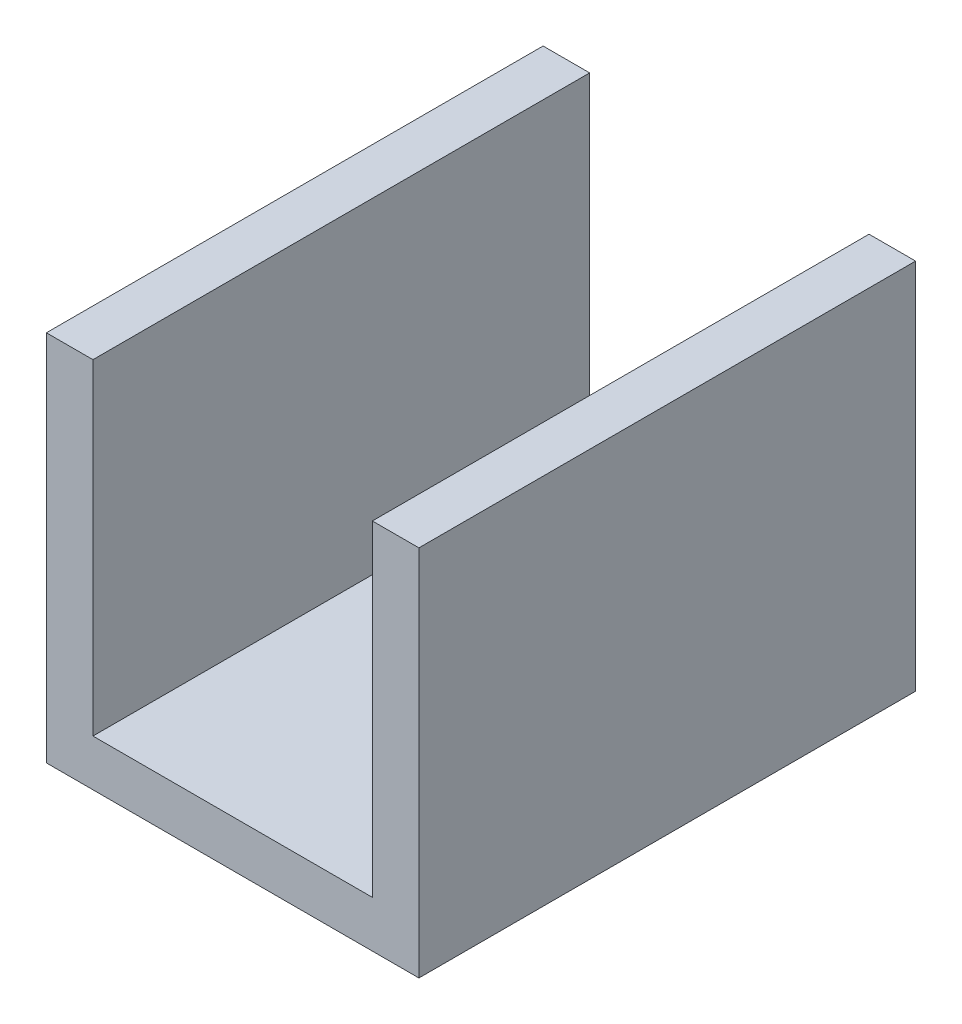
ISO-10303-21;
HEADER;
FILE_DESCRIPTION(('STEP AP214'),'2;1');
FILE_NAME('part.step','',(''),(''),'','','');
FILE_SCHEMA(('AUTOMOTIVE_DESIGN { 1 0 10303 214 1 1 1 1 }'));
ENDSEC;
DATA;
#1=APPLICATION_CONTEXT('core data for automotive mechanical design processes');
#2=APPLICATION_PROTOCOL_DEFINITION('international standard','automotive_design',2000,#1);
#3=PRODUCT_CONTEXT('',#1,'mechanical');
#4=PRODUCT('Part','Part','',(#3));
#5=PRODUCT_RELATED_PRODUCT_CATEGORY('part','',(#4));
#6=PRODUCT_DEFINITION_FORMATION('','',#4);
#7=PRODUCT_DEFINITION_CONTEXT('part definition',#1,'design');
#8=PRODUCT_DEFINITION('design','',#6,#7);
#9=PRODUCT_DEFINITION_SHAPE('','',#8);
#10=(LENGTH_UNIT() NAMED_UNIT(*) SI_UNIT(.MILLI.,.METRE.));
#11=(NAMED_UNIT(*) PLANE_ANGLE_UNIT() SI_UNIT($,.RADIAN.));
#12=(NAMED_UNIT(*) SI_UNIT($,.STERADIAN.) SOLID_ANGLE_UNIT());
#13=UNCERTAINTY_MEASURE_WITH_UNIT(LENGTH_MEASURE(1.E-05),#10,'distance_accuracy_value','');
#14=(GEOMETRIC_REPRESENTATION_CONTEXT(3) GLOBAL_UNCERTAINTY_ASSIGNED_CONTEXT((#13)) GLOBAL_UNIT_ASSIGNED_CONTEXT((#10,
#11,#12)) REPRESENTATION_CONTEXT('',''));
#15=CARTESIAN_POINT('',(0.,0.,0.));
#16=DIRECTION('',(0.,0.,1.));
#17=DIRECTION('',(1.,0.,0.));
#18=AXIS2_PLACEMENT_3D('',#15,#16,#17);
#19=CARTESIAN_POINT('',(-7.14375,2.38125,12.7));
#20=DIRECTION('',(-1.,0.,0.));
#21=DIRECTION('',(0.,-1.,0.));
#22=AXIS2_PLACEMENT_3D('',#19,#20,#21);
#23=PLANE('',#22);
#24=DIRECTION('',(0.,1.,0.));
#25=VECTOR('',#24,1.);
#26=CARTESIAN_POINT('',(-7.14375,2.38125,-12.7));
#27=LINE('',#26,#25);
#28=CARTESIAN_POINT('',(-7.14375,2.38125,-12.7));
#29=VERTEX_POINT('',#28);
#30=CARTESIAN_POINT('',(-7.14375,19.05,-12.7));
#31=VERTEX_POINT('',#30);
#32=EDGE_CURVE('E142',#29,#31,#27,.T.);
#33=ORIENTED_EDGE('',*,*,#32,.T.);
#34=DIRECTION('',(0.,0.,-1.));
#35=VECTOR('',#34,1.);
#36=CARTESIAN_POINT('',(-7.14375,19.05,12.7));
#37=LINE('',#36,#35);
#38=CARTESIAN_POINT('',(-7.14375,19.05,12.7));
#39=VERTEX_POINT('',#38);
#40=EDGE_CURVE('E11',#39,#31,#37,.T.);
#41=ORIENTED_EDGE('',*,*,#40,.F.);
#42=DIRECTION('',(0.,1.,0.));
#43=VECTOR('',#42,1.);
#44=CARTESIAN_POINT('',(-7.14375,2.38125,12.7));
#45=LINE('',#44,#43);
#46=CARTESIAN_POINT('',(-7.14375,2.38125,12.7));
#47=VERTEX_POINT('',#46);
#48=EDGE_CURVE('E164',#47,#39,#45,.T.);
#49=ORIENTED_EDGE('',*,*,#48,.F.);
#50=DIRECTION('',(0.,0.,-1.));
#51=VECTOR('',#50,1.);
#52=CARTESIAN_POINT('',(-7.14375,2.38125,12.7));
#53=LINE('',#52,#51);
#54=EDGE_CURVE('E138',#47,#29,#53,.T.);
#55=ORIENTED_EDGE('',*,*,#54,.T.);
#56=EDGE_LOOP('',(#33,#41,#49,#55));
#57=FACE_BOUND('',#56,.T.);
#58=ADVANCED_FACE('F41',(#57),#23,.F.);
#59=CARTESIAN_POINT('',(-7.14375,19.05,12.7));
#60=DIRECTION('',(0.,-1.,0.));
#61=DIRECTION('',(0.,0.,-1.));
#62=AXIS2_PLACEMENT_3D('',#59,#60,#61);
#63=PLANE('',#62);
#64=DIRECTION('',(-1.,0.,0.));
#65=VECTOR('',#64,1.);
#66=CARTESIAN_POINT('',(-7.14375,19.05,-12.7));
#67=LINE('',#66,#65);
#68=CARTESIAN_POINT('',(-9.525,19.05,-12.7));
#69=VERTEX_POINT('',#68);
#70=EDGE_CURVE('E146',#31,#69,#67,.T.);
#71=ORIENTED_EDGE('',*,*,#70,.T.);
#72=DIRECTION('',(0.,0.,-1.));
#73=VECTOR('',#72,1.);
#74=CARTESIAN_POINT('',(-9.525,19.05,12.7));
#75=LINE('',#74,#73);
#76=CARTESIAN_POINT('',(-9.525,19.05,12.7));
#77=VERTEX_POINT('',#76);
#78=EDGE_CURVE('E50',#77,#69,#75,.T.);
#79=ORIENTED_EDGE('',*,*,#78,.F.);
#80=DIRECTION('',(-1.,0.,0.));
#81=VECTOR('',#80,1.);
#82=CARTESIAN_POINT('',(-7.14375,19.05,12.7));
#83=LINE('',#82,#81);
#84=EDGE_CURVE('E101',#39,#77,#83,.T.);
#85=ORIENTED_EDGE('',*,*,#84,.F.);
#86=ORIENTED_EDGE('',*,*,#40,.T.);
#87=EDGE_LOOP('',(#71,#79,#85,#86));
#88=FACE_BOUND('',#87,.T.);
#89=ADVANCED_FACE('F210',(#88),#63,.F.);
#90=CARTESIAN_POINT('',(-9.525,19.05,12.7));
#91=DIRECTION('',(1.,0.,0.));
#92=DIRECTION('',(0.,1.,0.));
#93=AXIS2_PLACEMENT_3D('',#90,#91,#92);
#94=PLANE('',#93);
#95=DIRECTION('',(0.,-1.,0.));
#96=VECTOR('',#95,1.);
#97=CARTESIAN_POINT('',(-9.525,19.05,-12.7));
#98=LINE('',#97,#96);
#99=CARTESIAN_POINT('',(-9.525,0.,-12.7));
#100=VERTEX_POINT('',#99);
#101=EDGE_CURVE('E149',#69,#100,#98,.T.);
#102=ORIENTED_EDGE('',*,*,#101,.T.);
#103=DIRECTION('',(0.,0.,-1.));
#104=VECTOR('',#103,1.);
#105=CARTESIAN_POINT('',(-9.525,0.,12.7));
#106=LINE('',#105,#104);
#107=CARTESIAN_POINT('',(-9.525,0.,12.7));
#108=VERTEX_POINT('',#107);
#109=EDGE_CURVE('E175',#108,#100,#106,.T.);
#110=ORIENTED_EDGE('',*,*,#109,.F.);
#111=DIRECTION('',(0.,-1.,0.));
#112=VECTOR('',#111,1.);
#113=CARTESIAN_POINT('',(-9.525,19.05,12.7));
#114=LINE('',#113,#112);
#115=EDGE_CURVE('E185',#77,#108,#114,.T.);
#116=ORIENTED_EDGE('',*,*,#115,.F.);
#117=ORIENTED_EDGE('',*,*,#78,.T.);
#118=EDGE_LOOP('',(#102,#110,#116,#117));
#119=FACE_BOUND('',#118,.T.);
#120=ADVANCED_FACE('F183',(#119),#94,.F.);
#121=CARTESIAN_POINT('',(-9.525,0.,12.7));
#122=DIRECTION('',(0.,1.,0.));
#123=DIRECTION('',(0.,0.,1.));
#124=AXIS2_PLACEMENT_3D('',#121,#122,#123);
#125=PLANE('',#124);
#126=DIRECTION('',(1.,0.,0.));
#127=VECTOR('',#126,1.);
#128=CARTESIAN_POINT('',(-9.525,0.,-12.7));
#129=LINE('',#128,#127);
#130=CARTESIAN_POINT('',(9.525,0.,-12.7));
#131=VERTEX_POINT('',#130);
#132=EDGE_CURVE('E152',#100,#131,#129,.T.);
#133=ORIENTED_EDGE('',*,*,#132,.T.);
#134=DIRECTION('',(0.,0.,-1.));
#135=VECTOR('',#134,1.);
#136=CARTESIAN_POINT('',(9.525,0.,12.7));
#137=LINE('',#136,#135);
#138=CARTESIAN_POINT('',(9.525,0.,12.7));
#139=VERTEX_POINT('',#138);
#140=EDGE_CURVE('E171',#139,#131,#137,.T.);
#141=ORIENTED_EDGE('',*,*,#140,.F.);
#142=DIRECTION('',(1.,0.,0.));
#143=VECTOR('',#142,1.);
#144=CARTESIAN_POINT('',(-9.525,0.,12.7));
#145=LINE('',#144,#143);
#146=EDGE_CURVE('E198',#108,#139,#145,.T.);
#147=ORIENTED_EDGE('',*,*,#146,.F.);
#148=ORIENTED_EDGE('',*,*,#109,.T.);
#149=EDGE_LOOP('',(#133,#141,#147,#148));
#150=FACE_BOUND('',#149,.T.);
#151=ADVANCED_FACE('F193',(#150),#125,.F.);
#152=CARTESIAN_POINT('',(9.525,0.,12.7));
#153=DIRECTION('',(-1.,0.,0.));
#154=DIRECTION('',(0.,-1.,0.));
#155=AXIS2_PLACEMENT_3D('',#152,#153,#154);
#156=PLANE('',#155);
#157=DIRECTION('',(0.,1.,0.));
#158=VECTOR('',#157,1.);
#159=CARTESIAN_POINT('',(9.525,0.,-12.7));
#160=LINE('',#159,#158);
#161=CARTESIAN_POINT('',(9.525,19.05,-12.7));
#162=VERTEX_POINT('',#161);
#163=EDGE_CURVE('E155',#131,#162,#160,.T.);
#164=ORIENTED_EDGE('',*,*,#163,.T.);
#165=DIRECTION('',(0.,0.,-1.));
#166=VECTOR('',#165,1.);
#167=CARTESIAN_POINT('',(9.525,19.05,12.7));
#168=LINE('',#167,#166);
#169=CARTESIAN_POINT('',(9.525,19.05,12.7));
#170=VERTEX_POINT('',#169);
#171=EDGE_CURVE('E131',#170,#162,#168,.T.);
#172=ORIENTED_EDGE('',*,*,#171,.F.);
#173=DIRECTION('',(0.,1.,0.));
#174=VECTOR('',#173,1.);
#175=CARTESIAN_POINT('',(9.525,0.,12.7));
#176=LINE('',#175,#174);
#177=EDGE_CURVE('E120',#139,#170,#176,.T.);
#178=ORIENTED_EDGE('',*,*,#177,.F.);
#179=ORIENTED_EDGE('',*,*,#140,.T.);
#180=EDGE_LOOP('',(#164,#172,#178,#179));
#181=FACE_BOUND('',#180,.T.);
#182=ADVANCED_FACE('F196',(#181),#156,.F.);
#183=CARTESIAN_POINT('',(9.525,19.05,12.7));
#184=DIRECTION('',(0.,-1.,0.));
#185=DIRECTION('',(0.,0.,-1.));
#186=AXIS2_PLACEMENT_3D('',#183,#184,#185);
#187=PLANE('',#186);
#188=DIRECTION('',(-1.,0.,0.));
#189=VECTOR('',#188,1.);
#190=CARTESIAN_POINT('',(9.525,19.05,-12.7));
#191=LINE('',#190,#189);
#192=CARTESIAN_POINT('',(7.14375,19.05,-12.7));
#193=VERTEX_POINT('',#192);
#194=EDGE_CURVE('E129',#162,#193,#191,.T.);
#195=ORIENTED_EDGE('',*,*,#194,.T.);
#196=DIRECTION('',(0.,0.,-1.));
#197=VECTOR('',#196,1.);
#198=CARTESIAN_POINT('',(7.14375,19.05,12.7));
#199=LINE('',#198,#197);
#200=CARTESIAN_POINT('',(7.14375,19.05,12.7));
#201=VERTEX_POINT('',#200);
#202=EDGE_CURVE('E126',#201,#193,#199,.T.);
#203=ORIENTED_EDGE('',*,*,#202,.F.);
#204=DIRECTION('',(-1.,0.,0.));
#205=VECTOR('',#204,1.);
#206=CARTESIAN_POINT('',(9.525,19.05,12.7));
#207=LINE('',#206,#205);
#208=EDGE_CURVE('E114',#170,#201,#207,.T.);
#209=ORIENTED_EDGE('',*,*,#208,.F.);
#210=ORIENTED_EDGE('',*,*,#171,.T.);
#211=EDGE_LOOP('',(#195,#203,#209,#210));
#212=FACE_BOUND('',#211,.T.);
#213=ADVANCED_FACE('F127',(#212),#187,.F.);
#214=CARTESIAN_POINT('',(7.14375,19.05,12.7));
#215=DIRECTION('',(1.,0.,0.));
#216=DIRECTION('',(0.,1.,0.));
#217=AXIS2_PLACEMENT_3D('',#214,#215,#216);
#218=PLANE('',#217);
#219=DIRECTION('',(0.,-1.,0.));
#220=VECTOR('',#219,1.);
#221=CARTESIAN_POINT('',(7.14375,19.05,-12.7));
#222=LINE('',#221,#220);
#223=CARTESIAN_POINT('',(7.14375,2.38125,-12.7));
#224=VERTEX_POINT('',#223);
#225=EDGE_CURVE('E87',#193,#224,#222,.T.);
#226=ORIENTED_EDGE('',*,*,#225,.T.);
#227=DIRECTION('',(0.,0.,-1.));
#228=VECTOR('',#227,1.);
#229=CARTESIAN_POINT('',(7.14375,2.38125,12.7));
#230=LINE('',#229,#228);
#231=CARTESIAN_POINT('',(7.14375,2.38125,12.7));
#232=VERTEX_POINT('',#231);
#233=EDGE_CURVE('E132',#232,#224,#230,.T.);
#234=ORIENTED_EDGE('',*,*,#233,.F.);
#235=DIRECTION('',(0.,-1.,0.));
#236=VECTOR('',#235,1.);
#237=CARTESIAN_POINT('',(7.14375,19.05,12.7));
#238=LINE('',#237,#236);
#239=EDGE_CURVE('E118',#201,#232,#238,.T.);
#240=ORIENTED_EDGE('',*,*,#239,.F.);
#241=ORIENTED_EDGE('',*,*,#202,.T.);
#242=EDGE_LOOP('',(#226,#234,#240,#241));
#243=FACE_BOUND('',#242,.T.);
#244=ADVANCED_FACE('F134',(#243),#218,.F.);
#245=CARTESIAN_POINT('',(7.14375,2.38125,12.7));
#246=DIRECTION('',(0.,-1.,0.));
#247=DIRECTION('',(0.,0.,-1.));
#248=AXIS2_PLACEMENT_3D('',#245,#246,#247);
#249=PLANE('',#248);
#250=DIRECTION('',(-1.,0.,0.));
#251=VECTOR('',#250,1.);
#252=CARTESIAN_POINT('',(7.14375,2.38125,-12.7));
#253=LINE('',#252,#251);
#254=EDGE_CURVE('E93',#224,#29,#253,.T.);
#255=ORIENTED_EDGE('',*,*,#254,.T.);
#256=ORIENTED_EDGE('',*,*,#54,.F.);
#257=DIRECTION('',(-1.,0.,0.));
#258=VECTOR('',#257,1.);
#259=CARTESIAN_POINT('',(7.14375,2.38125,12.7));
#260=LINE('',#259,#258);
#261=EDGE_CURVE('E58',#232,#47,#260,.T.);
#262=ORIENTED_EDGE('',*,*,#261,.F.);
#263=ORIENTED_EDGE('',*,*,#233,.T.);
#264=EDGE_LOOP('',(#255,#256,#262,#263));
#265=FACE_BOUND('',#264,.T.);
#266=ADVANCED_FACE('F226',(#265),#249,.F.);
#267=CARTESIAN_POINT('',(-7.14375,19.05,12.7));
#268=DIRECTION('',(0.,0.,1.));
#269=DIRECTION('',(1.,0.,0.));
#270=AXIS2_PLACEMENT_3D('',#267,#268,#269);
#271=PLANE('',#270);
#272=ORIENTED_EDGE('',*,*,#48,.T.);
#273=ORIENTED_EDGE('',*,*,#84,.T.);
#274=ORIENTED_EDGE('',*,*,#115,.T.);
#275=ORIENTED_EDGE('',*,*,#146,.T.);
#276=ORIENTED_EDGE('',*,*,#177,.T.);
#277=ORIENTED_EDGE('',*,*,#208,.T.);
#278=ORIENTED_EDGE('',*,*,#239,.T.);
#279=ORIENTED_EDGE('',*,*,#261,.T.);
#280=EDGE_LOOP('',(#272,#273,#274,#275,#276,#277,#278,#279));
#281=FACE_BOUND('',#280,.T.);
#282=ADVANCED_FACE('F116',(#281),#271,.T.);
#283=CARTESIAN_POINT('',(-7.14375,19.05,-12.7));
#284=DIRECTION('',(0.,0.,1.));
#285=DIRECTION('',(1.,0.,0.));
#286=AXIS2_PLACEMENT_3D('',#283,#284,#285);
#287=PLANE('',#286);
#288=ORIENTED_EDGE('',*,*,#32,.F.);
#289=ORIENTED_EDGE('',*,*,#254,.F.);
#290=ORIENTED_EDGE('',*,*,#225,.F.);
#291=ORIENTED_EDGE('',*,*,#194,.F.);
#292=ORIENTED_EDGE('',*,*,#163,.F.);
#293=ORIENTED_EDGE('',*,*,#132,.F.);
#294=ORIENTED_EDGE('',*,*,#101,.F.);
#295=ORIENTED_EDGE('',*,*,#70,.F.);
#296=EDGE_LOOP('',(#288,#289,#290,#291,#292,#293,#294,#295));
#297=FACE_BOUND('',#296,.T.);
#298=ADVANCED_FACE('F189',(#297),#287,.F.);
#299=CLOSED_SHELL('',(#58,#89,#120,#151,#182,#213,#244,#266,#282,#298));
#300=MANIFOLD_SOLID_BREP('B2',#299);
#301=ADVANCED_BREP_SHAPE_REPRESENTATION('',(#18,#300),#14);
#302=SHAPE_DEFINITION_REPRESENTATION(#9,#301);
ENDSEC;
END-ISO-10303-21;
